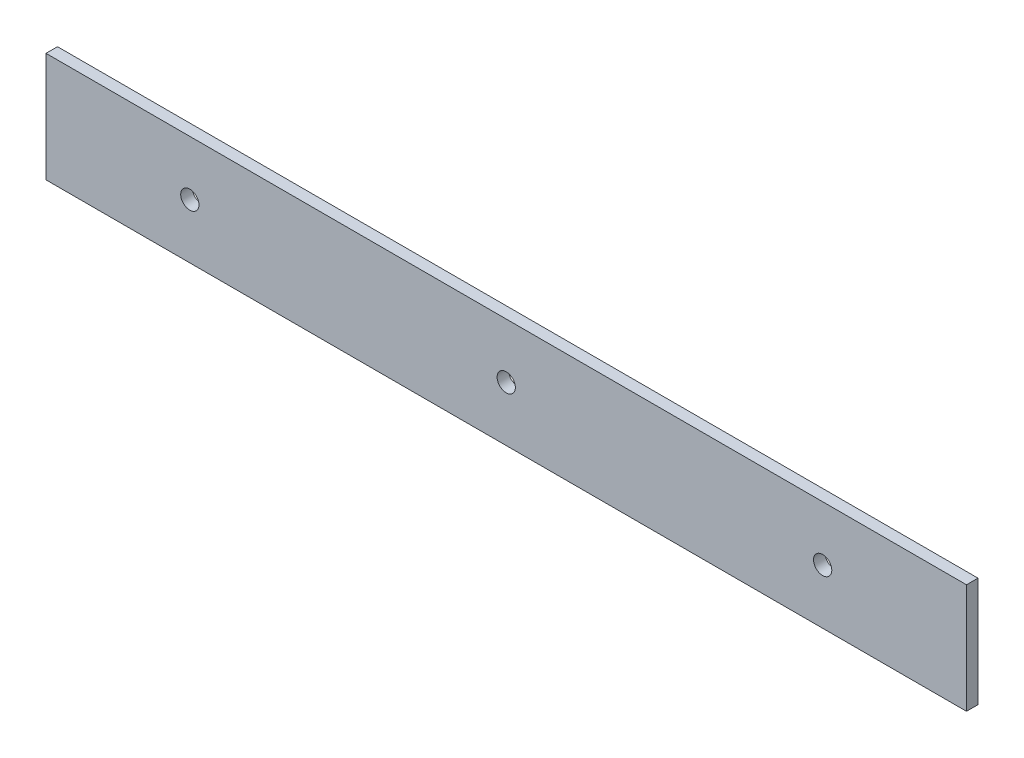
ISO-10303-21;
HEADER;
FILE_DESCRIPTION(('STEP AP214'),'2;1');
FILE_NAME('part.step','',(''),(''),'','','');
FILE_SCHEMA(('AUTOMOTIVE_DESIGN { 1 0 10303 214 1 1 1 1 }'));
ENDSEC;
DATA;
#1=APPLICATION_CONTEXT('core data for automotive mechanical design processes');
#2=APPLICATION_PROTOCOL_DEFINITION('international standard','automotive_design',2000,#1);
#3=PRODUCT_CONTEXT('',#1,'mechanical');
#4=PRODUCT('Part','Part','',(#3));
#5=PRODUCT_RELATED_PRODUCT_CATEGORY('part','',(#4));
#6=PRODUCT_DEFINITION_FORMATION('','',#4);
#7=PRODUCT_DEFINITION_CONTEXT('part definition',#1,'design');
#8=PRODUCT_DEFINITION('design','',#6,#7);
#9=PRODUCT_DEFINITION_SHAPE('','',#8);
#10=(LENGTH_UNIT() NAMED_UNIT(*) SI_UNIT(.MILLI.,.METRE.));
#11=(NAMED_UNIT(*) PLANE_ANGLE_UNIT() SI_UNIT($,.RADIAN.));
#12=(NAMED_UNIT(*) SI_UNIT($,.STERADIAN.) SOLID_ANGLE_UNIT());
#13=UNCERTAINTY_MEASURE_WITH_UNIT(LENGTH_MEASURE(1.E-05),#10,'distance_accuracy_value','');
#14=(GEOMETRIC_REPRESENTATION_CONTEXT(3) GLOBAL_UNCERTAINTY_ASSIGNED_CONTEXT((#13)) GLOBAL_UNIT_ASSIGNED_CONTEXT((#10,
#11,#12)) REPRESENTATION_CONTEXT('',''));
#15=CARTESIAN_POINT('',(0.,0.,0.));
#16=DIRECTION('',(0.,0.,1.));
#17=DIRECTION('',(1.,0.,0.));
#18=AXIS2_PLACEMENT_3D('',#15,#16,#17);
#19=CARTESIAN_POINT('',(-160.,-19.05,4.));
#20=DIRECTION('',(1.,0.,0.));
#21=DIRECTION('',(0.,0.,-1.));
#22=AXIS2_PLACEMENT_3D('',#19,#20,#21);
#23=PLANE('',#22);
#24=DIRECTION('',(0.,-1.,0.));
#25=VECTOR('',#24,1.);
#26=CARTESIAN_POINT('',(-160.,-19.05,0.));
#27=LINE('',#26,#25);
#28=CARTESIAN_POINT('',(-160.,19.05,0.));
#29=VERTEX_POINT('',#28);
#30=CARTESIAN_POINT('',(-160.,-19.05,0.));
#31=VERTEX_POINT('',#30);
#32=EDGE_CURVE('E99',#29,#31,#27,.T.);
#33=ORIENTED_EDGE('',*,*,#32,.T.);
#34=DIRECTION('',(0.,0.,-1.));
#35=VECTOR('',#34,1.);
#36=CARTESIAN_POINT('',(-160.,-19.05,4.));
#37=LINE('',#36,#35);
#38=CARTESIAN_POINT('',(-160.,-19.05,4.));
#39=VERTEX_POINT('',#38);
#40=EDGE_CURVE('E11',#39,#31,#37,.T.);
#41=ORIENTED_EDGE('',*,*,#40,.F.);
#42=DIRECTION('',(0.,-1.,0.));
#43=VECTOR('',#42,1.);
#44=CARTESIAN_POINT('',(-160.,-19.05,4.));
#45=LINE('',#44,#43);
#46=CARTESIAN_POINT('',(-160.,19.05,4.));
#47=VERTEX_POINT('',#46);
#48=EDGE_CURVE('E86',#47,#39,#45,.T.);
#49=ORIENTED_EDGE('',*,*,#48,.F.);
#50=DIRECTION('',(0.,0.,-1.));
#51=VECTOR('',#50,1.);
#52=CARTESIAN_POINT('',(-160.,19.05,4.));
#53=LINE('',#52,#51);
#54=EDGE_CURVE('E95',#47,#29,#53,.T.);
#55=ORIENTED_EDGE('',*,*,#54,.T.);
#56=EDGE_LOOP('',(#33,#41,#49,#55));
#57=FACE_BOUND('',#56,.T.);
#58=ADVANCED_FACE('F33',(#57),#23,.F.);
#59=CARTESIAN_POINT('',(160.,-19.05,4.));
#60=DIRECTION('',(0.,1.,0.));
#61=DIRECTION('',(-1.,0.,0.));
#62=AXIS2_PLACEMENT_3D('',#59,#60,#61);
#63=PLANE('',#62);
#64=DIRECTION('',(1.,0.,0.));
#65=VECTOR('',#64,1.);
#66=CARTESIAN_POINT('',(160.,-19.05,0.));
#67=LINE('',#66,#65);
#68=CARTESIAN_POINT('',(160.,-19.05,0.));
#69=VERTEX_POINT('',#68);
#70=EDGE_CURVE('E90',#31,#69,#67,.T.);
#71=ORIENTED_EDGE('',*,*,#70,.T.);
#72=DIRECTION('',(0.,0.,-1.));
#73=VECTOR('',#72,1.);
#74=CARTESIAN_POINT('',(160.,-19.05,4.));
#75=LINE('',#74,#73);
#76=CARTESIAN_POINT('',(160.,-19.05,4.));
#77=VERTEX_POINT('',#76);
#78=EDGE_CURVE('E42',#77,#69,#75,.T.);
#79=ORIENTED_EDGE('',*,*,#78,.F.);
#80=DIRECTION('',(1.,0.,0.));
#81=VECTOR('',#80,1.);
#82=CARTESIAN_POINT('',(160.,-19.05,4.));
#83=LINE('',#82,#81);
#84=EDGE_CURVE('E81',#39,#77,#83,.T.);
#85=ORIENTED_EDGE('',*,*,#84,.F.);
#86=ORIENTED_EDGE('',*,*,#40,.T.);
#87=EDGE_LOOP('',(#71,#79,#85,#86));
#88=FACE_BOUND('',#87,.T.);
#89=ADVANCED_FACE('F89',(#88),#63,.F.);
#90=CARTESIAN_POINT('',(160.,-19.05,4.));
#91=DIRECTION('',(-1.,0.,0.));
#92=DIRECTION('',(0.,0.,1.));
#93=AXIS2_PLACEMENT_3D('',#90,#91,#92);
#94=PLANE('',#93);
#95=DIRECTION('',(0.,1.,0.));
#96=VECTOR('',#95,1.);
#97=CARTESIAN_POINT('',(160.,-19.05,0.));
#98=LINE('',#97,#96);
#99=CARTESIAN_POINT('',(160.,19.05,0.));
#100=VERTEX_POINT('',#99);
#101=EDGE_CURVE('E68',#69,#100,#98,.T.);
#102=ORIENTED_EDGE('',*,*,#101,.T.);
#103=DIRECTION('',(0.,0.,-1.));
#104=VECTOR('',#103,1.);
#105=CARTESIAN_POINT('',(160.,19.05,4.));
#106=LINE('',#105,#104);
#107=CARTESIAN_POINT('',(160.,19.05,4.));
#108=VERTEX_POINT('',#107);
#109=EDGE_CURVE('E91',#108,#100,#106,.T.);
#110=ORIENTED_EDGE('',*,*,#109,.F.);
#111=DIRECTION('',(0.,1.,0.));
#112=VECTOR('',#111,1.);
#113=CARTESIAN_POINT('',(160.,-19.05,4.));
#114=LINE('',#113,#112);
#115=EDGE_CURVE('E84',#77,#108,#114,.T.);
#116=ORIENTED_EDGE('',*,*,#115,.F.);
#117=ORIENTED_EDGE('',*,*,#78,.T.);
#118=EDGE_LOOP('',(#102,#110,#116,#117));
#119=FACE_BOUND('',#118,.T.);
#120=ADVANCED_FACE('F93',(#119),#94,.F.);
#121=CARTESIAN_POINT('',(160.,19.05,4.));
#122=DIRECTION('',(0.,-1.,0.));
#123=DIRECTION('',(1.,0.,0.));
#124=AXIS2_PLACEMENT_3D('',#121,#122,#123);
#125=PLANE('',#124);
#126=DIRECTION('',(-1.,0.,0.));
#127=VECTOR('',#126,1.);
#128=CARTESIAN_POINT('',(160.,19.05,0.));
#129=LINE('',#128,#127);
#130=EDGE_CURVE('E74',#100,#29,#129,.T.);
#131=ORIENTED_EDGE('',*,*,#130,.T.);
#132=ORIENTED_EDGE('',*,*,#54,.F.);
#133=DIRECTION('',(-1.,0.,0.));
#134=VECTOR('',#133,1.);
#135=CARTESIAN_POINT('',(160.,19.05,4.));
#136=LINE('',#135,#134);
#137=EDGE_CURVE('E51',#108,#47,#136,.T.);
#138=ORIENTED_EDGE('',*,*,#137,.F.);
#139=ORIENTED_EDGE('',*,*,#109,.T.);
#140=EDGE_LOOP('',(#131,#132,#138,#139));
#141=FACE_BOUND('',#140,.T.);
#142=ADVANCED_FACE('F132',(#141),#125,.F.);
#143=CARTESIAN_POINT('',(0.,0.,4.));
#144=DIRECTION('',(0.,0.,1.));
#145=DIRECTION('',(1.,0.,0.));
#146=AXIS2_PLACEMENT_3D('',#143,#144,#145);
#147=PLANE('',#146);
#148=CARTESIAN_POINT('',(0.,0.,4.));
#149=DIRECTION('',(0.,0.,1.));
#150=DIRECTION('',(1.,0.,0.));
#151=AXIS2_PLACEMENT_3D('',#148,#149,#150);
#152=CIRCLE('',#151,3.175);
#153=CARTESIAN_POINT('',(3.175,0.,4.));
#154=VERTEX_POINT('',#153);
#155=EDGE_CURVE('E112',#154,#154,#152,.T.);
#156=ORIENTED_EDGE('',*,*,#155,.F.);
#157=EDGE_LOOP('',(#156));
#158=FACE_BOUND('',#157,.T.);
#159=CARTESIAN_POINT('',(-110.,0.,4.));
#160=DIRECTION('',(0.,0.,1.));
#161=DIRECTION('',(-1.,0.,0.));
#162=AXIS2_PLACEMENT_3D('',#159,#160,#161);
#163=CIRCLE('',#162,3.175);
#164=CARTESIAN_POINT('',(-113.175,0.,4.));
#165=VERTEX_POINT('',#164);
#166=EDGE_CURVE('E117',#165,#165,#163,.T.);
#167=ORIENTED_EDGE('',*,*,#166,.F.);
#168=EDGE_LOOP('',(#167));
#169=FACE_BOUND('',#168,.T.);
#170=CARTESIAN_POINT('',(110.,0.,4.));
#171=DIRECTION('',(0.,0.,1.));
#172=DIRECTION('',(1.,0.,0.));
#173=AXIS2_PLACEMENT_3D('',#170,#171,#172);
#174=CIRCLE('',#173,3.175);
#175=CARTESIAN_POINT('',(113.175,0.,4.));
#176=VERTEX_POINT('',#175);
#177=EDGE_CURVE('E109',#176,#176,#174,.T.);
#178=ORIENTED_EDGE('',*,*,#177,.F.);
#179=EDGE_LOOP('',(#178));
#180=FACE_BOUND('',#179,.T.);
#181=ORIENTED_EDGE('',*,*,#48,.T.);
#182=ORIENTED_EDGE('',*,*,#84,.T.);
#183=ORIENTED_EDGE('',*,*,#115,.T.);
#184=ORIENTED_EDGE('',*,*,#137,.T.);
#185=EDGE_LOOP('',(#181,#182,#183,#184));
#186=FACE_BOUND('',#185,.T.);
#187=ADVANCED_FACE('F82',(#158,#169,#180,#186),#147,.T.);
#188=CARTESIAN_POINT('',(0.,0.,0.));
#189=DIRECTION('',(0.,0.,1.));
#190=DIRECTION('',(1.,0.,0.));
#191=AXIS2_PLACEMENT_3D('',#188,#189,#190);
#192=PLANE('',#191);
#193=CARTESIAN_POINT('',(0.,0.,0.));
#194=DIRECTION('',(0.,0.,1.));
#195=DIRECTION('',(1.,0.,0.));
#196=AXIS2_PLACEMENT_3D('',#193,#194,#195);
#197=CIRCLE('',#196,3.175);
#198=CARTESIAN_POINT('',(3.175,0.,0.));
#199=VERTEX_POINT('',#198);
#200=EDGE_CURVE('E36',#199,#199,#197,.T.);
#201=ORIENTED_EDGE('',*,*,#200,.T.);
#202=EDGE_LOOP('',(#201));
#203=FACE_BOUND('',#202,.T.);
#204=CARTESIAN_POINT('',(-110.,0.,0.));
#205=DIRECTION('',(0.,0.,1.));
#206=DIRECTION('',(1.,0.,0.));
#207=AXIS2_PLACEMENT_3D('',#204,#205,#206);
#208=CIRCLE('',#207,3.175);
#209=CARTESIAN_POINT('',(-106.825,0.,0.));
#210=VERTEX_POINT('',#209);
#211=EDGE_CURVE('E110',#210,#210,#208,.T.);
#212=ORIENTED_EDGE('',*,*,#211,.T.);
#213=EDGE_LOOP('',(#212));
#214=FACE_BOUND('',#213,.T.);
#215=CARTESIAN_POINT('',(110.,0.,0.));
#216=DIRECTION('',(0.,0.,1.));
#217=DIRECTION('',(1.,0.,0.));
#218=AXIS2_PLACEMENT_3D('',#215,#216,#217);
#219=CIRCLE('',#218,3.175);
#220=CARTESIAN_POINT('',(113.175,0.,0.));
#221=VERTEX_POINT('',#220);
#222=EDGE_CURVE('E102',#221,#221,#219,.T.);
#223=ORIENTED_EDGE('',*,*,#222,.T.);
#224=EDGE_LOOP('',(#223));
#225=FACE_BOUND('',#224,.T.);
#226=ORIENTED_EDGE('',*,*,#32,.F.);
#227=ORIENTED_EDGE('',*,*,#130,.F.);
#228=ORIENTED_EDGE('',*,*,#101,.F.);
#229=ORIENTED_EDGE('',*,*,#70,.F.);
#230=EDGE_LOOP('',(#226,#227,#228,#229));
#231=FACE_BOUND('',#230,.T.);
#232=ADVANCED_FACE('F131',(#203,#214,#225,#231),#192,.F.);
#233=CARTESIAN_POINT('',(110.,0.,-6.));
#234=DIRECTION('',(0.,0.,1.));
#235=DIRECTION('',(1.,0.,0.));
#236=AXIS2_PLACEMENT_3D('',#233,#234,#235);
#237=CYLINDRICAL_SURFACE('',#236,3.175);
#238=ORIENTED_EDGE('',*,*,#177,.T.);
#239=EDGE_LOOP('',(#238));
#240=FACE_BOUND('',#239,.T.);
#241=ORIENTED_EDGE('',*,*,#222,.F.);
#242=EDGE_LOOP('',(#241));
#243=FACE_BOUND('',#242,.T.);
#244=ADVANCED_FACE('F127',(#240,#243),#237,.F.);
#245=CARTESIAN_POINT('',(-110.,0.,-6.));
#246=DIRECTION('',(0.,0.,1.));
#247=DIRECTION('',(1.,0.,0.));
#248=AXIS2_PLACEMENT_3D('',#245,#246,#247);
#249=CYLINDRICAL_SURFACE('',#248,3.175);
#250=ORIENTED_EDGE('',*,*,#166,.T.);
#251=EDGE_LOOP('',(#250));
#252=FACE_BOUND('',#251,.T.);
#253=ORIENTED_EDGE('',*,*,#211,.F.);
#254=EDGE_LOOP('',(#253));
#255=FACE_BOUND('',#254,.T.);
#256=ADVANCED_FACE('F178',(#252,#255),#249,.F.);
#257=CARTESIAN_POINT('',(0.,0.,-6.));
#258=DIRECTION('',(0.,0.,1.));
#259=DIRECTION('',(1.,0.,0.));
#260=AXIS2_PLACEMENT_3D('',#257,#258,#259);
#261=CYLINDRICAL_SURFACE('',#260,3.175);
#262=ORIENTED_EDGE('',*,*,#155,.T.);
#263=EDGE_LOOP('',(#262));
#264=FACE_BOUND('',#263,.T.);
#265=ORIENTED_EDGE('',*,*,#200,.F.);
#266=EDGE_LOOP('',(#265));
#267=FACE_BOUND('',#266,.T.);
#268=ADVANCED_FACE('F183',(#264,#267),#261,.F.);
#269=CLOSED_SHELL('',(#58,#89,#120,#142,#187,#232,#244,#256,#268));
#270=MANIFOLD_SOLID_BREP('B2',#269);
#271=ADVANCED_BREP_SHAPE_REPRESENTATION('',(#18,#270),#14);
#272=SHAPE_DEFINITION_REPRESENTATION(#9,#271);
ENDSEC;
END-ISO-10303-21;
